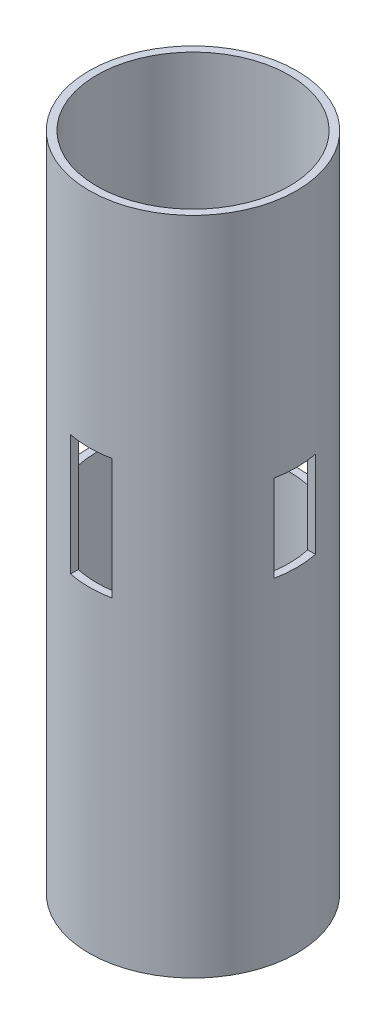
ISO-10303-21;
HEADER;
FILE_DESCRIPTION(('STEP AP214'),'2;1');
FILE_NAME('part.step','',(''),(''),'','','');
FILE_SCHEMA(('AUTOMOTIVE_DESIGN { 1 0 10303 214 1 1 1 1 }'));
ENDSEC;
DATA;
#1=APPLICATION_CONTEXT('core data for automotive mechanical design processes');
#2=APPLICATION_PROTOCOL_DEFINITION('international standard','automotive_design',2000,#1);
#3=PRODUCT_CONTEXT('',#1,'mechanical');
#4=PRODUCT('Part','Part','',(#3));
#5=PRODUCT_RELATED_PRODUCT_CATEGORY('part','',(#4));
#6=PRODUCT_DEFINITION_FORMATION('','',#4);
#7=PRODUCT_DEFINITION_CONTEXT('part definition',#1,'design');
#8=PRODUCT_DEFINITION('design','',#6,#7);
#9=PRODUCT_DEFINITION_SHAPE('','',#8);
#10=(LENGTH_UNIT() NAMED_UNIT(*) SI_UNIT(.MILLI.,.METRE.));
#11=(NAMED_UNIT(*) PLANE_ANGLE_UNIT() SI_UNIT($,.RADIAN.));
#12=(NAMED_UNIT(*) SI_UNIT($,.STERADIAN.) SOLID_ANGLE_UNIT());
#13=UNCERTAINTY_MEASURE_WITH_UNIT(LENGTH_MEASURE(1.E-05),#10,'distance_accuracy_value','');
#14=(GEOMETRIC_REPRESENTATION_CONTEXT(3) GLOBAL_UNCERTAINTY_ASSIGNED_CONTEXT((#13)) GLOBAL_UNIT_ASSIGNED_CONTEXT((#10,
#11,#12)) REPRESENTATION_CONTEXT('',''));
#15=CARTESIAN_POINT('',(0.,0.,0.));
#16=DIRECTION('',(0.,0.,1.));
#17=DIRECTION('',(1.,0.,0.));
#18=AXIS2_PLACEMENT_3D('',#15,#16,#17);
#19=CARTESIAN_POINT('',(0.,175.,0.));
#20=DIRECTION('',(0.,-1.,0.));
#21=DIRECTION('',(0.,0.,-1.));
#22=AXIS2_PLACEMENT_3D('',#19,#20,#21);
#23=CYLINDRICAL_SURFACE('',#22,27.5);
#24=DIRECTION('',(0.,-1.,0.));
#25=VECTOR('',#24,1.);
#26=CARTESIAN_POINT('',(5.49999999999999,175.,-26.944387170615));
#27=LINE('',#26,#25);
#28=CARTESIAN_POINT('',(5.5,116.,-26.944387170615));
#29=VERTEX_POINT('',#28);
#30=CARTESIAN_POINT('',(5.5,84.,-26.944387170615));
#31=VERTEX_POINT('',#30);
#32=EDGE_CURVE('E255',#29,#31,#27,.T.);
#33=ORIENTED_EDGE('',*,*,#32,.F.);
#34=CARTESIAN_POINT('',(0.,116.,0.));
#35=DIRECTION('',(0.,1.,0.));
#36=DIRECTION('',(0.,0.,1.));
#37=AXIS2_PLACEMENT_3D('',#34,#35,#36);
#38=CIRCLE('',#37,27.5);
#39=CARTESIAN_POINT('',(-5.5,116.,-26.944387170615));
#40=VERTEX_POINT('',#39);
#41=EDGE_CURVE('E240',#29,#40,#38,.T.);
#42=ORIENTED_EDGE('',*,*,#41,.T.);
#43=DIRECTION('',(0.,-1.,0.));
#44=VECTOR('',#43,1.);
#45=CARTESIAN_POINT('',(-5.50000000000001,175.,-26.944387170615));
#46=LINE('',#45,#44);
#47=CARTESIAN_POINT('',(-5.5,84.,-26.944387170615));
#48=VERTEX_POINT('',#47);
#49=EDGE_CURVE('E262',#40,#48,#46,.T.);
#50=ORIENTED_EDGE('',*,*,#49,.T.);
#51=CARTESIAN_POINT('',(0.,84.,0.));
#52=DIRECTION('',(0.,1.,0.));
#53=DIRECTION('',(0.,0.,1.));
#54=AXIS2_PLACEMENT_3D('',#51,#52,#53);
#55=CIRCLE('',#54,27.5);
#56=EDGE_CURVE('E59',#31,#48,#55,.T.);
#57=ORIENTED_EDGE('',*,*,#56,.F.);
#58=EDGE_LOOP('',(#33,#42,#50,#57));
#59=FACE_BOUND('',#58,.T.);
#60=CARTESIAN_POINT('',(-5.5,116.,26.944387170615));
#61=VERTEX_POINT('',#60);
#62=CARTESIAN_POINT('',(5.5,116.,26.944387170615));
#63=VERTEX_POINT('',#62);
#64=EDGE_CURVE('E253',#61,#63,#38,.T.);
#65=ORIENTED_EDGE('',*,*,#64,.T.);
#66=DIRECTION('',(0.,-1.,0.));
#67=VECTOR('',#66,1.);
#68=CARTESIAN_POINT('',(5.49999999999999,175.,26.944387170615));
#69=LINE('',#68,#67);
#70=CARTESIAN_POINT('',(5.5,84.,26.944387170615));
#71=VERTEX_POINT('',#70);
#72=EDGE_CURVE('E257',#71,#63,#69,.F.);
#73=ORIENTED_EDGE('',*,*,#72,.F.);
#74=CARTESIAN_POINT('',(-5.5,84.,26.944387170615));
#75=VERTEX_POINT('',#74);
#76=EDGE_CURVE('E261',#75,#71,#55,.T.);
#77=ORIENTED_EDGE('',*,*,#76,.F.);
#78=DIRECTION('',(0.,-1.,0.));
#79=VECTOR('',#78,1.);
#80=CARTESIAN_POINT('',(-5.50000000000001,175.,26.944387170615));
#81=LINE('',#80,#79);
#82=EDGE_CURVE('E264',#75,#61,#81,.F.);
#83=ORIENTED_EDGE('',*,*,#82,.T.);
#84=EDGE_LOOP('',(#65,#73,#77,#83));
#85=FACE_BOUND('',#84,.T.);
#86=CARTESIAN_POINT('',(0.,111.5,0.));
#87=DIRECTION('',(0.,-1.,0.));
#88=DIRECTION('',(0.,0.,-1.));
#89=AXIS2_PLACEMENT_3D('',#86,#87,#88);
#90=CIRCLE('',#89,27.5);
#91=CARTESIAN_POINT('',(26.944387170615,111.5,-5.49999999999999));
#92=VERTEX_POINT('',#91);
#93=CARTESIAN_POINT('',(26.944387170615,111.5,5.50000000000001));
#94=VERTEX_POINT('',#93);
#95=EDGE_CURVE('E233',#92,#94,#90,.T.);
#96=ORIENTED_EDGE('',*,*,#95,.F.);
#97=DIRECTION('',(0.,-1.,0.));
#98=VECTOR('',#97,1.);
#99=CARTESIAN_POINT('',(26.944387170615,175.,-5.49999999999998));
#100=LINE('',#99,#98);
#101=CARTESIAN_POINT('',(26.944387170615,88.5,-5.5));
#102=VERTEX_POINT('',#101);
#103=EDGE_CURVE('E222',#102,#92,#100,.F.);
#104=ORIENTED_EDGE('',*,*,#103,.F.);
#105=CARTESIAN_POINT('',(0.,88.5,0.));
#106=DIRECTION('',(0.,-1.,0.));
#107=DIRECTION('',(0.,0.,-1.));
#108=AXIS2_PLACEMENT_3D('',#105,#106,#107);
#109=CIRCLE('',#108,27.5);
#110=CARTESIAN_POINT('',(26.9443871706149,88.5,5.5));
#111=VERTEX_POINT('',#110);
#112=EDGE_CURVE('E224',#102,#111,#109,.T.);
#113=ORIENTED_EDGE('',*,*,#112,.T.);
#114=DIRECTION('',(0.,-1.,0.));
#115=VECTOR('',#114,1.);
#116=CARTESIAN_POINT('',(26.944387170615,175.,5.50000000000002));
#117=LINE('',#116,#115);
#118=EDGE_CURVE('E230',#111,#94,#117,.F.);
#119=ORIENTED_EDGE('',*,*,#118,.T.);
#120=EDGE_LOOP('',(#96,#104,#113,#119));
#121=FACE_BOUND('',#120,.T.);
#122=CARTESIAN_POINT('',(0.,175.,0.));
#123=DIRECTION('',(0.,1.,0.));
#124=DIRECTION('',(0.,0.,1.));
#125=AXIS2_PLACEMENT_3D('',#122,#123,#124);
#126=CIRCLE('',#125,27.5);
#127=CARTESIAN_POINT('',(0.,175.,27.5));
#128=VERTEX_POINT('',#127);
#129=EDGE_CURVE('E207',#128,#128,#126,.T.);
#130=ORIENTED_EDGE('',*,*,#129,.F.);
#131=EDGE_LOOP('',(#130));
#132=FACE_BOUND('',#131,.T.);
#133=CARTESIAN_POINT('',(0.,0.,0.));
#134=DIRECTION('',(0.,1.,0.));
#135=DIRECTION('',(0.,0.,1.));
#136=AXIS2_PLACEMENT_3D('',#133,#134,#135);
#137=CIRCLE('',#136,27.5);
#138=CARTESIAN_POINT('',(0.,0.,27.5));
#139=VERTEX_POINT('',#138);
#140=EDGE_CURVE('E208',#139,#139,#137,.T.);
#141=ORIENTED_EDGE('',*,*,#140,.T.);
#142=EDGE_LOOP('',(#141));
#143=FACE_BOUND('',#142,.T.);
#144=DIRECTION('',(0.,-1.,0.));
#145=VECTOR('',#144,1.);
#146=CARTESIAN_POINT('',(-26.944387170615,175.,5.50000000000002));
#147=LINE('',#146,#145);
#148=CARTESIAN_POINT('',(-26.944387170615,111.5,5.50000000000001));
#149=VERTEX_POINT('',#148);
#150=CARTESIAN_POINT('',(-26.944387170615,88.5,5.5));
#151=VERTEX_POINT('',#150);
#152=EDGE_CURVE('E227',#149,#151,#147,.T.);
#153=ORIENTED_EDGE('',*,*,#152,.T.);
#154=CARTESIAN_POINT('',(-26.944387170615,88.5,-5.5));
#155=VERTEX_POINT('',#154);
#156=EDGE_CURVE('E226',#151,#155,#109,.T.);
#157=ORIENTED_EDGE('',*,*,#156,.T.);
#158=DIRECTION('',(0.,-1.,0.));
#159=VECTOR('',#158,1.);
#160=CARTESIAN_POINT('',(-26.944387170615,175.,-5.49999999999998));
#161=LINE('',#160,#159);
#162=CARTESIAN_POINT('',(-26.944387170615,111.5,-5.49999999999999));
#163=VERTEX_POINT('',#162);
#164=EDGE_CURVE('E217',#163,#155,#161,.T.);
#165=ORIENTED_EDGE('',*,*,#164,.F.);
#166=EDGE_CURVE('E235',#149,#163,#90,.T.);
#167=ORIENTED_EDGE('',*,*,#166,.F.);
#168=EDGE_LOOP('',(#153,#157,#165,#167));
#169=FACE_BOUND('',#168,.T.);
#170=ADVANCED_FACE('F43',(#59,#85,#121,#132,#143,#169),#23,.T.);
#171=CARTESIAN_POINT('',(0.,175.,0.));
#172=DIRECTION('',(0.,-1.,0.));
#173=DIRECTION('',(0.,0.,-1.));
#174=AXIS2_PLACEMENT_3D('',#171,#172,#173);
#175=CYLINDRICAL_SURFACE('',#174,25.5);
#176=CARTESIAN_POINT('',(0.,116.,0.));
#177=DIRECTION('',(0.,1.,0.));
#178=DIRECTION('',(0.,0.,1.));
#179=AXIS2_PLACEMENT_3D('',#176,#177,#178);
#180=CIRCLE('',#179,25.5);
#181=CARTESIAN_POINT('',(5.5,116.,-24.8997991959775));
#182=VERTEX_POINT('',#181);
#183=CARTESIAN_POINT('',(-5.50000000000001,116.,-24.8997991959775));
#184=VERTEX_POINT('',#183);
#185=EDGE_CURVE('E11',#182,#184,#180,.T.);
#186=ORIENTED_EDGE('',*,*,#185,.F.);
#187=DIRECTION('',(0.,-1.,0.));
#188=VECTOR('',#187,1.);
#189=CARTESIAN_POINT('',(5.49999999999999,175.,-24.8997991959775));
#190=LINE('',#189,#188);
#191=CARTESIAN_POINT('',(5.5,84.,-24.8997991959775));
#192=VERTEX_POINT('',#191);
#193=EDGE_CURVE('E46',#182,#192,#190,.T.);
#194=ORIENTED_EDGE('',*,*,#193,.T.);
#195=CARTESIAN_POINT('',(0.,84.,0.));
#196=DIRECTION('',(0.,1.,0.));
#197=DIRECTION('',(0.,0.,1.));
#198=AXIS2_PLACEMENT_3D('',#195,#196,#197);
#199=CIRCLE('',#198,25.5);
#200=CARTESIAN_POINT('',(-5.5,84.,-24.8997991959775));
#201=VERTEX_POINT('',#200);
#202=EDGE_CURVE('E169',#192,#201,#199,.T.);
#203=ORIENTED_EDGE('',*,*,#202,.T.);
#204=DIRECTION('',(0.,-1.,0.));
#205=VECTOR('',#204,1.);
#206=CARTESIAN_POINT('',(-5.50000000000001,175.,-24.8997991959775));
#207=LINE('',#206,#205);
#208=EDGE_CURVE('E159',#184,#201,#207,.T.);
#209=ORIENTED_EDGE('',*,*,#208,.F.);
#210=EDGE_LOOP('',(#186,#194,#203,#209));
#211=FACE_BOUND('',#210,.T.);
#212=CARTESIAN_POINT('',(-5.5,116.,24.8997991959775));
#213=VERTEX_POINT('',#212);
#214=CARTESIAN_POINT('',(5.5,116.,24.8997991959775));
#215=VERTEX_POINT('',#214);
#216=EDGE_CURVE('E52',#213,#215,#180,.T.);
#217=ORIENTED_EDGE('',*,*,#216,.F.);
#218=DIRECTION('',(0.,-1.,0.));
#219=VECTOR('',#218,1.);
#220=CARTESIAN_POINT('',(-5.50000000000001,175.,24.8997991959775));
#221=LINE('',#220,#219);
#222=CARTESIAN_POINT('',(-5.50000000000001,84.,24.8997991959775));
#223=VERTEX_POINT('',#222);
#224=EDGE_CURVE('E184',#223,#213,#221,.F.);
#225=ORIENTED_EDGE('',*,*,#224,.F.);
#226=CARTESIAN_POINT('',(5.5,84.,24.8997991959775));
#227=VERTEX_POINT('',#226);
#228=EDGE_CURVE('E179',#223,#227,#199,.T.);
#229=ORIENTED_EDGE('',*,*,#228,.T.);
#230=DIRECTION('',(0.,-1.,0.));
#231=VECTOR('',#230,1.);
#232=CARTESIAN_POINT('',(5.49999999999999,175.,24.8997991959775));
#233=LINE('',#232,#231);
#234=EDGE_CURVE('E183',#227,#215,#233,.F.);
#235=ORIENTED_EDGE('',*,*,#234,.T.);
#236=EDGE_LOOP('',(#217,#225,#229,#235));
#237=FACE_BOUND('',#236,.T.);
#238=CARTESIAN_POINT('',(0.,175.,0.));
#239=DIRECTION('',(0.,1.,0.));
#240=DIRECTION('',(0.,0.,1.));
#241=AXIS2_PLACEMENT_3D('',#238,#239,#240);
#242=CIRCLE('',#241,25.5);
#243=CARTESIAN_POINT('',(0.,175.,25.5));
#244=VERTEX_POINT('',#243);
#245=EDGE_CURVE('E211',#244,#244,#242,.T.);
#246=ORIENTED_EDGE('',*,*,#245,.T.);
#247=EDGE_LOOP('',(#246));
#248=FACE_BOUND('',#247,.T.);
#249=CARTESIAN_POINT('',(0.,0.,0.));
#250=DIRECTION('',(0.,1.,0.));
#251=DIRECTION('',(0.,0.,1.));
#252=AXIS2_PLACEMENT_3D('',#249,#250,#251);
#253=CIRCLE('',#252,25.5);
#254=CARTESIAN_POINT('',(0.,0.,25.5));
#255=VERTEX_POINT('',#254);
#256=EDGE_CURVE('E214',#255,#255,#253,.T.);
#257=ORIENTED_EDGE('',*,*,#256,.F.);
#258=EDGE_LOOP('',(#257));
#259=FACE_BOUND('',#258,.T.);
#260=CARTESIAN_POINT('',(0.,111.5,0.));
#261=DIRECTION('',(0.,-1.,0.));
#262=DIRECTION('',(0.,0.,-1.));
#263=AXIS2_PLACEMENT_3D('',#260,#261,#262);
#264=CIRCLE('',#263,25.5);
#265=CARTESIAN_POINT('',(-24.8997991959775,111.5,5.50000000000001));
#266=VERTEX_POINT('',#265);
#267=CARTESIAN_POINT('',(-24.8997991959775,111.5,-5.49999999999999));
#268=VERTEX_POINT('',#267);
#269=EDGE_CURVE('E204',#266,#268,#264,.T.);
#270=ORIENTED_EDGE('',*,*,#269,.T.);
#271=DIRECTION('',(0.,-1.,0.));
#272=VECTOR('',#271,1.);
#273=CARTESIAN_POINT('',(-24.8997991959775,175.,-5.49999999999998));
#274=LINE('',#273,#272);
#275=CARTESIAN_POINT('',(-24.8997991959775,88.5,-5.5));
#276=VERTEX_POINT('',#275);
#277=EDGE_CURVE('E197',#268,#276,#274,.T.);
#278=ORIENTED_EDGE('',*,*,#277,.T.);
#279=CARTESIAN_POINT('',(0.,88.5,0.));
#280=DIRECTION('',(0.,-1.,0.));
#281=DIRECTION('',(0.,0.,-1.));
#282=AXIS2_PLACEMENT_3D('',#279,#280,#281);
#283=CIRCLE('',#282,25.5);
#284=CARTESIAN_POINT('',(-24.8997991959775,88.5,5.5));
#285=VERTEX_POINT('',#284);
#286=EDGE_CURVE('E200',#285,#276,#283,.T.);
#287=ORIENTED_EDGE('',*,*,#286,.F.);
#288=DIRECTION('',(0.,-1.,0.));
#289=VECTOR('',#288,1.);
#290=CARTESIAN_POINT('',(-24.8997991959775,175.,5.50000000000002));
#291=LINE('',#290,#289);
#292=EDGE_CURVE('E202',#266,#285,#291,.T.);
#293=ORIENTED_EDGE('',*,*,#292,.F.);
#294=EDGE_LOOP('',(#270,#278,#287,#293));
#295=FACE_BOUND('',#294,.T.);
#296=CARTESIAN_POINT('',(24.8997991959775,88.5,-5.5));
#297=VERTEX_POINT('',#296);
#298=CARTESIAN_POINT('',(24.8997991959775,88.5,5.5));
#299=VERTEX_POINT('',#298);
#300=EDGE_CURVE('E190',#297,#299,#283,.T.);
#301=ORIENTED_EDGE('',*,*,#300,.F.);
#302=DIRECTION('',(0.,-1.,0.));
#303=VECTOR('',#302,1.);
#304=CARTESIAN_POINT('',(24.8997991959775,175.,-5.49999999999998));
#305=LINE('',#304,#303);
#306=CARTESIAN_POINT('',(24.8997991959775,111.5,-5.49999999999999));
#307=VERTEX_POINT('',#306);
#308=EDGE_CURVE('E188',#297,#307,#305,.F.);
#309=ORIENTED_EDGE('',*,*,#308,.T.);
#310=CARTESIAN_POINT('',(24.8997991959775,111.5,5.50000000000001));
#311=VERTEX_POINT('',#310);
#312=EDGE_CURVE('E196',#307,#311,#264,.T.);
#313=ORIENTED_EDGE('',*,*,#312,.T.);
#314=DIRECTION('',(0.,-1.,0.));
#315=VECTOR('',#314,1.);
#316=CARTESIAN_POINT('',(24.8997991959775,175.,5.50000000000002));
#317=LINE('',#316,#315);
#318=EDGE_CURVE('E193',#299,#311,#317,.F.);
#319=ORIENTED_EDGE('',*,*,#318,.F.);
#320=EDGE_LOOP('',(#301,#309,#313,#319));
#321=FACE_BOUND('',#320,.T.);
#322=ADVANCED_FACE('F176',(#211,#237,#248,#259,#295,#321),#175,.F.);
#323=CARTESIAN_POINT('',(0.,175.,0.));
#324=DIRECTION('',(0.,1.,0.));
#325=DIRECTION('',(0.,0.,1.));
#326=AXIS2_PLACEMENT_3D('',#323,#324,#325);
#327=PLANE('',#326);
#328=ORIENTED_EDGE('',*,*,#129,.T.);
#329=EDGE_LOOP('',(#328));
#330=FACE_BOUND('',#329,.T.);
#331=ORIENTED_EDGE('',*,*,#245,.F.);
#332=EDGE_LOOP('',(#331));
#333=FACE_BOUND('',#332,.T.);
#334=ADVANCED_FACE('F301',(#330,#333),#327,.T.);
#335=CARTESIAN_POINT('',(0.,0.,0.));
#336=DIRECTION('',(0.,1.,0.));
#337=DIRECTION('',(0.,0.,1.));
#338=AXIS2_PLACEMENT_3D('',#335,#336,#337);
#339=PLANE('',#338);
#340=ORIENTED_EDGE('',*,*,#140,.F.);
#341=EDGE_LOOP('',(#340));
#342=FACE_BOUND('',#341,.T.);
#343=ORIENTED_EDGE('',*,*,#256,.T.);
#344=EDGE_LOOP('',(#343));
#345=FACE_BOUND('',#344,.T.);
#346=ADVANCED_FACE('F306',(#342,#345),#339,.F.);
#347=CARTESIAN_POINT('',(-27.5,111.5,0.));
#348=DIRECTION('',(0.,-1.,0.));
#349=DIRECTION('',(0.,0.,-1.));
#350=AXIS2_PLACEMENT_3D('',#347,#348,#349);
#351=PLANE('',#350);
#352=ORIENTED_EDGE('',*,*,#166,.T.);
#353=DIRECTION('',(1.,0.,0.));
#354=VECTOR('',#353,1.);
#355=CARTESIAN_POINT('',(-27.5,111.5,-5.49999999999999));
#356=LINE('',#355,#354);
#357=EDGE_CURVE('E239',#163,#268,#356,.T.);
#358=ORIENTED_EDGE('',*,*,#357,.T.);
#359=ORIENTED_EDGE('',*,*,#269,.F.);
#360=DIRECTION('',(1.,0.,0.));
#361=VECTOR('',#360,1.);
#362=CARTESIAN_POINT('',(-27.5,111.5,5.50000000000001));
#363=LINE('',#362,#361);
#364=EDGE_CURVE('E244',#149,#266,#363,.T.);
#365=ORIENTED_EDGE('',*,*,#364,.F.);
#366=EDGE_LOOP('',(#352,#358,#359,#365));
#367=FACE_BOUND('',#366,.T.);
#368=ADVANCED_FACE('F313',(#367),#351,.T.);
#369=CARTESIAN_POINT('',(-27.5,0.,5.49999999999999));
#370=DIRECTION('',(0.,0.,1.));
#371=DIRECTION('',(0.,-1.,0.));
#372=AXIS2_PLACEMENT_3D('',#369,#370,#371);
#373=PLANE('',#372);
#374=ORIENTED_EDGE('',*,*,#364,.T.);
#375=ORIENTED_EDGE('',*,*,#292,.T.);
#376=DIRECTION('',(1.,0.,0.));
#377=VECTOR('',#376,1.);
#378=CARTESIAN_POINT('',(-27.5,88.5,5.5));
#379=LINE('',#378,#377);
#380=EDGE_CURVE('E248',#151,#285,#379,.T.);
#381=ORIENTED_EDGE('',*,*,#380,.F.);
#382=ORIENTED_EDGE('',*,*,#152,.F.);
#383=EDGE_LOOP('',(#374,#375,#381,#382));
#384=FACE_BOUND('',#383,.T.);
#385=ADVANCED_FACE('F318',(#384),#373,.F.);
#386=CARTESIAN_POINT('',(-27.5,88.5,0.));
#387=DIRECTION('',(0.,-1.,0.));
#388=DIRECTION('',(0.,0.,-1.));
#389=AXIS2_PLACEMENT_3D('',#386,#387,#388);
#390=PLANE('',#389);
#391=ORIENTED_EDGE('',*,*,#380,.T.);
#392=ORIENTED_EDGE('',*,*,#286,.T.);
#393=DIRECTION('',(1.,0.,0.));
#394=VECTOR('',#393,1.);
#395=CARTESIAN_POINT('',(-27.5,88.5,-5.5));
#396=LINE('',#395,#394);
#397=EDGE_CURVE('E252',#155,#276,#396,.T.);
#398=ORIENTED_EDGE('',*,*,#397,.F.);
#399=ORIENTED_EDGE('',*,*,#156,.F.);
#400=EDGE_LOOP('',(#391,#392,#398,#399));
#401=FACE_BOUND('',#400,.T.);
#402=ADVANCED_FACE('F356',(#401),#390,.F.);
#403=CARTESIAN_POINT('',(-27.5,0.,-5.50000000000001));
#404=DIRECTION('',(0.,0.,1.));
#405=DIRECTION('',(0.,-1.,0.));
#406=AXIS2_PLACEMENT_3D('',#403,#404,#405);
#407=PLANE('',#406);
#408=ORIENTED_EDGE('',*,*,#164,.T.);
#409=ORIENTED_EDGE('',*,*,#397,.T.);
#410=ORIENTED_EDGE('',*,*,#277,.F.);
#411=ORIENTED_EDGE('',*,*,#357,.F.);
#412=EDGE_LOOP('',(#408,#409,#410,#411));
#413=FACE_BOUND('',#412,.T.);
#414=ADVANCED_FACE('F310',(#413),#407,.T.);
#415=ORIENTED_EDGE('',*,*,#103,.T.);
#416=EDGE_CURVE('E236',#307,#92,#356,.T.);
#417=ORIENTED_EDGE('',*,*,#416,.F.);
#418=ORIENTED_EDGE('',*,*,#308,.F.);
#419=EDGE_CURVE('E249',#297,#102,#396,.T.);
#420=ORIENTED_EDGE('',*,*,#419,.T.);
#421=EDGE_LOOP('',(#415,#417,#418,#420));
#422=FACE_BOUND('',#421,.T.);
#423=ADVANCED_FACE('F343',(#422),#407,.T.);
#424=ORIENTED_EDGE('',*,*,#419,.F.);
#425=ORIENTED_EDGE('',*,*,#300,.T.);
#426=EDGE_CURVE('E245',#299,#111,#379,.T.);
#427=ORIENTED_EDGE('',*,*,#426,.T.);
#428=ORIENTED_EDGE('',*,*,#112,.F.);
#429=EDGE_LOOP('',(#424,#425,#427,#428));
#430=FACE_BOUND('',#429,.T.);
#431=ADVANCED_FACE('F334',(#430),#390,.F.);
#432=ORIENTED_EDGE('',*,*,#426,.F.);
#433=ORIENTED_EDGE('',*,*,#318,.T.);
#434=EDGE_CURVE('E241',#311,#94,#363,.T.);
#435=ORIENTED_EDGE('',*,*,#434,.T.);
#436=ORIENTED_EDGE('',*,*,#118,.F.);
#437=EDGE_LOOP('',(#432,#433,#435,#436));
#438=FACE_BOUND('',#437,.T.);
#439=ADVANCED_FACE('F337',(#438),#373,.F.);
#440=ORIENTED_EDGE('',*,*,#95,.T.);
#441=ORIENTED_EDGE('',*,*,#434,.F.);
#442=ORIENTED_EDGE('',*,*,#312,.F.);
#443=ORIENTED_EDGE('',*,*,#416,.T.);
#444=EDGE_LOOP('',(#440,#441,#442,#443));
#445=FACE_BOUND('',#444,.T.);
#446=ADVANCED_FACE('F320',(#445),#351,.T.);
#447=CARTESIAN_POINT('',(-5.49999999999998,0.,-27.5));
#448=DIRECTION('',(-1.,0.,0.));
#449=DIRECTION('',(0.,-1.,0.));
#450=AXIS2_PLACEMENT_3D('',#447,#448,#449);
#451=PLANE('',#450);
#452=DIRECTION('',(0.,0.,1.));
#453=VECTOR('',#452,1.);
#454=CARTESIAN_POINT('',(-5.5,84.,-27.5));
#455=LINE('',#454,#453);
#456=EDGE_CURVE('E173',#223,#75,#455,.T.);
#457=ORIENTED_EDGE('',*,*,#456,.F.);
#458=ORIENTED_EDGE('',*,*,#224,.T.);
#459=DIRECTION('',(0.,0.,1.));
#460=VECTOR('',#459,1.);
#461=CARTESIAN_POINT('',(-5.5,116.,-27.5));
#462=LINE('',#461,#460);
#463=EDGE_CURVE('E67',#213,#61,#462,.T.);
#464=ORIENTED_EDGE('',*,*,#463,.T.);
#465=ORIENTED_EDGE('',*,*,#82,.F.);
#466=EDGE_LOOP('',(#457,#458,#464,#465));
#467=FACE_BOUND('',#466,.T.);
#468=ADVANCED_FACE('F347',(#467),#451,.F.);
#469=CARTESIAN_POINT('',(0.,84.,-27.5));
#470=DIRECTION('',(0.,1.,0.));
#471=DIRECTION('',(0.,0.,1.));
#472=AXIS2_PLACEMENT_3D('',#469,#470,#471);
#473=PLANE('',#472);
#474=ORIENTED_EDGE('',*,*,#76,.T.);
#475=DIRECTION('',(0.,0.,1.));
#476=VECTOR('',#475,1.);
#477=CARTESIAN_POINT('',(5.5,84.,-27.5));
#478=LINE('',#477,#476);
#479=EDGE_CURVE('E172',#227,#71,#478,.T.);
#480=ORIENTED_EDGE('',*,*,#479,.F.);
#481=ORIENTED_EDGE('',*,*,#228,.F.);
#482=ORIENTED_EDGE('',*,*,#456,.T.);
#483=EDGE_LOOP('',(#474,#480,#481,#482));
#484=FACE_BOUND('',#483,.T.);
#485=ADVANCED_FACE('F353',(#484),#473,.T.);
#486=CARTESIAN_POINT('',(5.50000000000001,0.,-27.5));
#487=DIRECTION('',(-1.,0.,0.));
#488=DIRECTION('',(0.,-1.,0.));
#489=AXIS2_PLACEMENT_3D('',#486,#487,#488);
#490=PLANE('',#489);
#491=ORIENTED_EDGE('',*,*,#72,.T.);
#492=DIRECTION('',(0.,0.,1.));
#493=VECTOR('',#492,1.);
#494=CARTESIAN_POINT('',(5.5,116.,-27.5));
#495=LINE('',#494,#493);
#496=EDGE_CURVE('E273',#215,#63,#495,.T.);
#497=ORIENTED_EDGE('',*,*,#496,.F.);
#498=ORIENTED_EDGE('',*,*,#234,.F.);
#499=ORIENTED_EDGE('',*,*,#479,.T.);
#500=EDGE_LOOP('',(#491,#497,#498,#499));
#501=FACE_BOUND('',#500,.T.);
#502=ADVANCED_FACE('F294',(#501),#490,.T.);
#503=CARTESIAN_POINT('',(0.,116.,-27.5));
#504=DIRECTION('',(0.,1.,0.));
#505=DIRECTION('',(0.,0.,1.));
#506=AXIS2_PLACEMENT_3D('',#503,#504,#505);
#507=PLANE('',#506);
#508=ORIENTED_EDGE('',*,*,#64,.F.);
#509=ORIENTED_EDGE('',*,*,#463,.F.);
#510=ORIENTED_EDGE('',*,*,#216,.T.);
#511=ORIENTED_EDGE('',*,*,#496,.T.);
#512=EDGE_LOOP('',(#508,#509,#510,#511));
#513=FACE_BOUND('',#512,.T.);
#514=ADVANCED_FACE('F287',(#513),#507,.F.);
#515=EDGE_CURVE('E267',#29,#182,#495,.T.);
#516=ORIENTED_EDGE('',*,*,#515,.T.);
#517=ORIENTED_EDGE('',*,*,#185,.T.);
#518=EDGE_CURVE('E165',#40,#184,#462,.T.);
#519=ORIENTED_EDGE('',*,*,#518,.F.);
#520=ORIENTED_EDGE('',*,*,#41,.F.);
#521=EDGE_LOOP('',(#516,#517,#519,#520));
#522=FACE_BOUND('',#521,.T.);
#523=ADVANCED_FACE('F285',(#522),#507,.F.);
#524=ORIENTED_EDGE('',*,*,#32,.T.);
#525=EDGE_CURVE('E272',#31,#192,#478,.T.);
#526=ORIENTED_EDGE('',*,*,#525,.T.);
#527=ORIENTED_EDGE('',*,*,#193,.F.);
#528=ORIENTED_EDGE('',*,*,#515,.F.);
#529=EDGE_LOOP('',(#524,#526,#527,#528));
#530=FACE_BOUND('',#529,.T.);
#531=ADVANCED_FACE('F279',(#530),#490,.T.);
#532=ORIENTED_EDGE('',*,*,#56,.T.);
#533=EDGE_CURVE('E162',#48,#201,#455,.T.);
#534=ORIENTED_EDGE('',*,*,#533,.T.);
#535=ORIENTED_EDGE('',*,*,#202,.F.);
#536=ORIENTED_EDGE('',*,*,#525,.F.);
#537=EDGE_LOOP('',(#532,#534,#535,#536));
#538=FACE_BOUND('',#537,.T.);
#539=ADVANCED_FACE('F170',(#538),#473,.T.);
#540=ORIENTED_EDGE('',*,*,#518,.T.);
#541=ORIENTED_EDGE('',*,*,#208,.T.);
#542=ORIENTED_EDGE('',*,*,#533,.F.);
#543=ORIENTED_EDGE('',*,*,#49,.F.);
#544=EDGE_LOOP('',(#540,#541,#542,#543));
#545=FACE_BOUND('',#544,.T.);
#546=ADVANCED_FACE('F160',(#545),#451,.F.);
#547=CLOSED_SHELL('',(#170,#322,#334,#346,#368,#385,#402,#414,#423,#431,#439,#446,#468,#485,
#502,#514,#523,#531,#539,#546));
#548=MANIFOLD_SOLID_BREP('B2',#547);
#549=ADVANCED_BREP_SHAPE_REPRESENTATION('',(#18,#548),#14);
#550=SHAPE_DEFINITION_REPRESENTATION(#9,#549);
ENDSEC;
END-ISO-10303-21;
